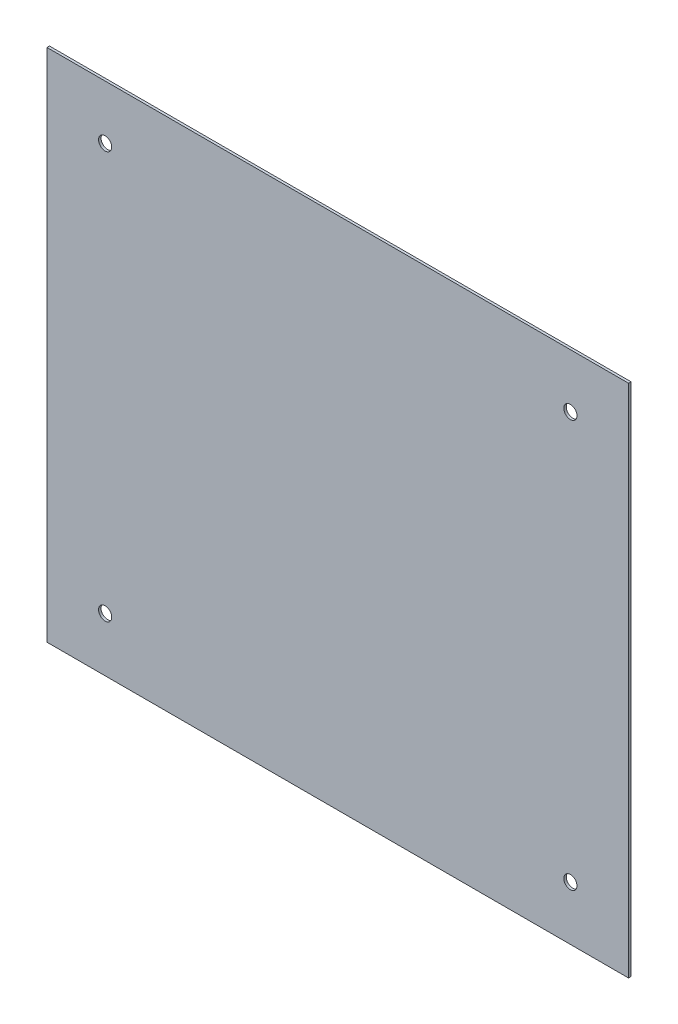
ISO-10303-21;
HEADER;
FILE_DESCRIPTION(('STEP AP214'),'2;1');
FILE_NAME('part.step','',(''),(''),'','','');
FILE_SCHEMA(('AUTOMOTIVE_DESIGN { 1 0 10303 214 1 1 1 1 }'));
ENDSEC;
DATA;
#1=APPLICATION_CONTEXT('core data for automotive mechanical design processes');
#2=APPLICATION_PROTOCOL_DEFINITION('international standard','automotive_design',2000,#1);
#3=PRODUCT_CONTEXT('',#1,'mechanical');
#4=PRODUCT('Part','Part','',(#3));
#5=PRODUCT_RELATED_PRODUCT_CATEGORY('part','',(#4));
#6=PRODUCT_DEFINITION_FORMATION('','',#4);
#7=PRODUCT_DEFINITION_CONTEXT('part definition',#1,'design');
#8=PRODUCT_DEFINITION('design','',#6,#7);
#9=PRODUCT_DEFINITION_SHAPE('','',#8);
#10=(LENGTH_UNIT() NAMED_UNIT(*) SI_UNIT(.MILLI.,.METRE.));
#11=(NAMED_UNIT(*) PLANE_ANGLE_UNIT() SI_UNIT($,.RADIAN.));
#12=(NAMED_UNIT(*) SI_UNIT($,.STERADIAN.) SOLID_ANGLE_UNIT());
#13=UNCERTAINTY_MEASURE_WITH_UNIT(LENGTH_MEASURE(1.E-05),#10,'distance_accuracy_value','');
#14=(GEOMETRIC_REPRESENTATION_CONTEXT(3) GLOBAL_UNCERTAINTY_ASSIGNED_CONTEXT((#13)) GLOBAL_UNIT_ASSIGNED_CONTEXT((#10,
#11,#12)) REPRESENTATION_CONTEXT('',''));
#15=CARTESIAN_POINT('',(0.,0.,0.));
#16=DIRECTION('',(0.,0.,1.));
#17=DIRECTION('',(1.,0.,0.));
#18=AXIS2_PLACEMENT_3D('',#15,#16,#17);
#19=CARTESIAN_POINT('',(-175.,-155.,1.5));
#20=DIRECTION('',(1.,0.,0.));
#21=DIRECTION('',(0.,0.,-1.));
#22=AXIS2_PLACEMENT_3D('',#19,#20,#21);
#23=PLANE('',#22);
#24=DIRECTION('',(0.,-1.,0.));
#25=VECTOR('',#24,1.);
#26=CARTESIAN_POINT('',(-175.,-155.,0.));
#27=LINE('',#26,#25);
#28=CARTESIAN_POINT('',(-175.,155.,0.));
#29=VERTEX_POINT('',#28);
#30=CARTESIAN_POINT('',(-175.,-155.,0.));
#31=VERTEX_POINT('',#30);
#32=EDGE_CURVE('E103',#29,#31,#27,.T.);
#33=ORIENTED_EDGE('',*,*,#32,.T.);
#34=DIRECTION('',(0.,0.,-1.));
#35=VECTOR('',#34,1.);
#36=CARTESIAN_POINT('',(-175.,-155.,1.5));
#37=LINE('',#36,#35);
#38=CARTESIAN_POINT('',(-175.,-155.,1.5));
#39=VERTEX_POINT('',#38);
#40=EDGE_CURVE('E11',#39,#31,#37,.T.);
#41=ORIENTED_EDGE('',*,*,#40,.F.);
#42=DIRECTION('',(0.,-1.,0.));
#43=VECTOR('',#42,1.);
#44=CARTESIAN_POINT('',(-175.,-155.,1.5));
#45=LINE('',#44,#43);
#46=CARTESIAN_POINT('',(-175.,155.,1.5));
#47=VERTEX_POINT('',#46);
#48=EDGE_CURVE('E90',#47,#39,#45,.T.);
#49=ORIENTED_EDGE('',*,*,#48,.F.);
#50=DIRECTION('',(0.,0.,-1.));
#51=VECTOR('',#50,1.);
#52=CARTESIAN_POINT('',(-175.,155.,1.5));
#53=LINE('',#52,#51);
#54=EDGE_CURVE('E99',#47,#29,#53,.T.);
#55=ORIENTED_EDGE('',*,*,#54,.T.);
#56=EDGE_LOOP('',(#33,#41,#49,#55));
#57=FACE_BOUND('',#56,.T.);
#58=ADVANCED_FACE('F37',(#57),#23,.F.);
#59=CARTESIAN_POINT('',(175.,-155.,1.5));
#60=DIRECTION('',(0.,1.,0.));
#61=DIRECTION('',(-1.,0.,0.));
#62=AXIS2_PLACEMENT_3D('',#59,#60,#61);
#63=PLANE('',#62);
#64=DIRECTION('',(1.,0.,0.));
#65=VECTOR('',#64,1.);
#66=CARTESIAN_POINT('',(175.,-155.,0.));
#67=LINE('',#66,#65);
#68=CARTESIAN_POINT('',(175.,-155.,0.));
#69=VERTEX_POINT('',#68);
#70=EDGE_CURVE('E94',#31,#69,#67,.T.);
#71=ORIENTED_EDGE('',*,*,#70,.T.);
#72=DIRECTION('',(0.,0.,-1.));
#73=VECTOR('',#72,1.);
#74=CARTESIAN_POINT('',(175.,-155.,1.5));
#75=LINE('',#74,#73);
#76=CARTESIAN_POINT('',(175.,-155.,1.5));
#77=VERTEX_POINT('',#76);
#78=EDGE_CURVE('E46',#77,#69,#75,.T.);
#79=ORIENTED_EDGE('',*,*,#78,.F.);
#80=DIRECTION('',(1.,0.,0.));
#81=VECTOR('',#80,1.);
#82=CARTESIAN_POINT('',(175.,-155.,1.5));
#83=LINE('',#82,#81);
#84=EDGE_CURVE('E85',#39,#77,#83,.T.);
#85=ORIENTED_EDGE('',*,*,#84,.F.);
#86=ORIENTED_EDGE('',*,*,#40,.T.);
#87=EDGE_LOOP('',(#71,#79,#85,#86));
#88=FACE_BOUND('',#87,.T.);
#89=ADVANCED_FACE('F93',(#88),#63,.F.);
#90=CARTESIAN_POINT('',(175.,-155.,1.5));
#91=DIRECTION('',(-1.,0.,0.));
#92=DIRECTION('',(0.,0.,1.));
#93=AXIS2_PLACEMENT_3D('',#90,#91,#92);
#94=PLANE('',#93);
#95=DIRECTION('',(0.,1.,0.));
#96=VECTOR('',#95,1.);
#97=CARTESIAN_POINT('',(175.,-155.,0.));
#98=LINE('',#97,#96);
#99=CARTESIAN_POINT('',(175.,155.,0.));
#100=VERTEX_POINT('',#99);
#101=EDGE_CURVE('E72',#69,#100,#98,.T.);
#102=ORIENTED_EDGE('',*,*,#101,.T.);
#103=DIRECTION('',(0.,0.,-1.));
#104=VECTOR('',#103,1.);
#105=CARTESIAN_POINT('',(175.,155.,1.5));
#106=LINE('',#105,#104);
#107=CARTESIAN_POINT('',(175.,155.,1.5));
#108=VERTEX_POINT('',#107);
#109=EDGE_CURVE('E95',#108,#100,#106,.T.);
#110=ORIENTED_EDGE('',*,*,#109,.F.);
#111=DIRECTION('',(0.,1.,0.));
#112=VECTOR('',#111,1.);
#113=CARTESIAN_POINT('',(175.,-155.,1.5));
#114=LINE('',#113,#112);
#115=EDGE_CURVE('E88',#77,#108,#114,.T.);
#116=ORIENTED_EDGE('',*,*,#115,.F.);
#117=ORIENTED_EDGE('',*,*,#78,.T.);
#118=EDGE_LOOP('',(#102,#110,#116,#117));
#119=FACE_BOUND('',#118,.T.);
#120=ADVANCED_FACE('F97',(#119),#94,.F.);
#121=CARTESIAN_POINT('',(175.,155.,1.5));
#122=DIRECTION('',(0.,-1.,0.));
#123=DIRECTION('',(1.,0.,0.));
#124=AXIS2_PLACEMENT_3D('',#121,#122,#123);
#125=PLANE('',#124);
#126=DIRECTION('',(-1.,0.,0.));
#127=VECTOR('',#126,1.);
#128=CARTESIAN_POINT('',(175.,155.,0.));
#129=LINE('',#128,#127);
#130=EDGE_CURVE('E78',#100,#29,#129,.T.);
#131=ORIENTED_EDGE('',*,*,#130,.T.);
#132=ORIENTED_EDGE('',*,*,#54,.F.);
#133=DIRECTION('',(-1.,0.,0.));
#134=VECTOR('',#133,1.);
#135=CARTESIAN_POINT('',(175.,155.,1.5));
#136=LINE('',#135,#134);
#137=EDGE_CURVE('E55',#108,#47,#136,.T.);
#138=ORIENTED_EDGE('',*,*,#137,.F.);
#139=ORIENTED_EDGE('',*,*,#109,.T.);
#140=EDGE_LOOP('',(#131,#132,#138,#139));
#141=FACE_BOUND('',#140,.T.);
#142=ADVANCED_FACE('F151',(#141),#125,.F.);
#143=CARTESIAN_POINT('',(0.,0.,1.5));
#144=DIRECTION('',(0.,0.,1.));
#145=DIRECTION('',(1.,0.,0.));
#146=AXIS2_PLACEMENT_3D('',#143,#144,#145);
#147=PLANE('',#146);
#148=CARTESIAN_POINT('',(140.,122.5,1.5));
#149=DIRECTION('',(0.,0.,1.));
#150=DIRECTION('',(1.,0.,0.));
#151=AXIS2_PLACEMENT_3D('',#148,#149,#150);
#152=CIRCLE('',#151,3.96999999999999);
#153=CARTESIAN_POINT('',(143.97,122.5,1.5));
#154=VERTEX_POINT('',#153);
#155=EDGE_CURVE('E115',#154,#154,#152,.F.);
#156=ORIENTED_EDGE('',*,*,#155,.T.);
#157=EDGE_LOOP('',(#156));
#158=FACE_BOUND('',#157,.T.);
#159=CARTESIAN_POINT('',(-140.,-122.5,1.5));
#160=DIRECTION('',(0.,0.,1.));
#161=DIRECTION('',(1.,0.,0.));
#162=AXIS2_PLACEMENT_3D('',#159,#160,#161);
#163=CIRCLE('',#162,3.96999999999999);
#164=CARTESIAN_POINT('',(-136.03,-122.5,1.5));
#165=VERTEX_POINT('',#164);
#166=EDGE_CURVE('E121',#165,#165,#163,.F.);
#167=ORIENTED_EDGE('',*,*,#166,.T.);
#168=EDGE_LOOP('',(#167));
#169=FACE_BOUND('',#168,.T.);
#170=CARTESIAN_POINT('',(140.,-122.5,1.5));
#171=DIRECTION('',(0.,0.,1.));
#172=DIRECTION('',(1.,0.,0.));
#173=AXIS2_PLACEMENT_3D('',#170,#171,#172);
#174=CIRCLE('',#173,3.96999999999999);
#175=CARTESIAN_POINT('',(143.97,-122.5,1.5));
#176=VERTEX_POINT('',#175);
#177=EDGE_CURVE('E118',#176,#176,#174,.F.);
#178=ORIENTED_EDGE('',*,*,#177,.T.);
#179=EDGE_LOOP('',(#178));
#180=FACE_BOUND('',#179,.T.);
#181=CARTESIAN_POINT('',(-140.,122.5,1.5));
#182=DIRECTION('',(0.,0.,1.));
#183=DIRECTION('',(1.,0.,0.));
#184=AXIS2_PLACEMENT_3D('',#181,#182,#183);
#185=CIRCLE('',#184,3.96999999999999);
#186=CARTESIAN_POINT('',(-136.03,122.5,1.5));
#187=VERTEX_POINT('',#186);
#188=EDGE_CURVE('E106',#187,#187,#185,.F.);
#189=ORIENTED_EDGE('',*,*,#188,.T.);
#190=EDGE_LOOP('',(#189));
#191=FACE_BOUND('',#190,.T.);
#192=ORIENTED_EDGE('',*,*,#48,.T.);
#193=ORIENTED_EDGE('',*,*,#84,.T.);
#194=ORIENTED_EDGE('',*,*,#115,.T.);
#195=ORIENTED_EDGE('',*,*,#137,.T.);
#196=EDGE_LOOP('',(#192,#193,#194,#195));
#197=FACE_BOUND('',#196,.T.);
#198=ADVANCED_FACE('F86',(#158,#169,#180,#191,#197),#147,.T.);
#199=CARTESIAN_POINT('',(0.,0.,0.));
#200=DIRECTION('',(0.,0.,1.));
#201=DIRECTION('',(1.,0.,0.));
#202=AXIS2_PLACEMENT_3D('',#199,#200,#201);
#203=PLANE('',#202);
#204=CARTESIAN_POINT('',(140.,122.5,0.));
#205=DIRECTION('',(0.,0.,1.));
#206=DIRECTION('',(1.,0.,0.));
#207=AXIS2_PLACEMENT_3D('',#204,#205,#206);
#208=CIRCLE('',#207,3.96999999999999);
#209=CARTESIAN_POINT('',(143.97,122.5,0.));
#210=VERTEX_POINT('',#209);
#211=EDGE_CURVE('E40',#210,#210,#208,.F.);
#212=ORIENTED_EDGE('',*,*,#211,.F.);
#213=EDGE_LOOP('',(#212));
#214=FACE_BOUND('',#213,.T.);
#215=CARTESIAN_POINT('',(-140.,-122.5,0.));
#216=DIRECTION('',(0.,0.,1.));
#217=DIRECTION('',(1.,0.,0.));
#218=AXIS2_PLACEMENT_3D('',#215,#216,#217);
#219=CIRCLE('',#218,3.96999999999999);
#220=CARTESIAN_POINT('',(-136.03,-122.5,0.));
#221=VERTEX_POINT('',#220);
#222=EDGE_CURVE('E119',#221,#221,#219,.F.);
#223=ORIENTED_EDGE('',*,*,#222,.F.);
#224=EDGE_LOOP('',(#223));
#225=FACE_BOUND('',#224,.T.);
#226=CARTESIAN_POINT('',(140.,-122.5,0.));
#227=DIRECTION('',(0.,0.,1.));
#228=DIRECTION('',(1.,0.,0.));
#229=AXIS2_PLACEMENT_3D('',#226,#227,#228);
#230=CIRCLE('',#229,3.96999999999999);
#231=CARTESIAN_POINT('',(143.97,-122.5,0.));
#232=VERTEX_POINT('',#231);
#233=EDGE_CURVE('E116',#232,#232,#230,.F.);
#234=ORIENTED_EDGE('',*,*,#233,.F.);
#235=EDGE_LOOP('',(#234));
#236=FACE_BOUND('',#235,.T.);
#237=CARTESIAN_POINT('',(-140.,122.5,0.));
#238=DIRECTION('',(0.,0.,1.));
#239=DIRECTION('',(1.,0.,0.));
#240=AXIS2_PLACEMENT_3D('',#237,#238,#239);
#241=CIRCLE('',#240,3.96999999999999);
#242=CARTESIAN_POINT('',(-136.03,122.5,0.));
#243=VERTEX_POINT('',#242);
#244=EDGE_CURVE('E112',#243,#243,#241,.F.);
#245=ORIENTED_EDGE('',*,*,#244,.F.);
#246=EDGE_LOOP('',(#245));
#247=FACE_BOUND('',#246,.T.);
#248=ORIENTED_EDGE('',*,*,#32,.F.);
#249=ORIENTED_EDGE('',*,*,#130,.F.);
#250=ORIENTED_EDGE('',*,*,#101,.F.);
#251=ORIENTED_EDGE('',*,*,#70,.F.);
#252=EDGE_LOOP('',(#248,#249,#250,#251));
#253=FACE_BOUND('',#252,.T.);
#254=ADVANCED_FACE('F141',(#214,#225,#236,#247,#253),#203,.F.);
#255=CARTESIAN_POINT('',(-140.,122.5,11.5));
#256=DIRECTION('',(0.,0.,-1.));
#257=DIRECTION('',(-1.,0.,0.));
#258=AXIS2_PLACEMENT_3D('',#255,#256,#257);
#259=CYLINDRICAL_SURFACE('',#258,3.96999999999999);
#260=ORIENTED_EDGE('',*,*,#188,.F.);
#261=EDGE_LOOP('',(#260));
#262=FACE_BOUND('',#261,.T.);
#263=ORIENTED_EDGE('',*,*,#244,.T.);
#264=EDGE_LOOP('',(#263));
#265=FACE_BOUND('',#264,.T.);
#266=ADVANCED_FACE('F137',(#262,#265),#259,.F.);
#267=CARTESIAN_POINT('',(140.,-122.5,11.5));
#268=DIRECTION('',(0.,0.,-1.));
#269=DIRECTION('',(-1.,0.,0.));
#270=AXIS2_PLACEMENT_3D('',#267,#268,#269);
#271=CYLINDRICAL_SURFACE('',#270,3.96999999999999);
#272=ORIENTED_EDGE('',*,*,#177,.F.);
#273=EDGE_LOOP('',(#272));
#274=FACE_BOUND('',#273,.T.);
#275=ORIENTED_EDGE('',*,*,#233,.T.);
#276=EDGE_LOOP('',(#275));
#277=FACE_BOUND('',#276,.T.);
#278=ADVANCED_FACE('F140',(#274,#277),#271,.F.);
#279=CARTESIAN_POINT('',(-140.,-122.5,11.5));
#280=DIRECTION('',(0.,0.,-1.));
#281=DIRECTION('',(-1.,0.,0.));
#282=AXIS2_PLACEMENT_3D('',#279,#280,#281);
#283=CYLINDRICAL_SURFACE('',#282,3.96999999999999);
#284=ORIENTED_EDGE('',*,*,#166,.F.);
#285=EDGE_LOOP('',(#284));
#286=FACE_BOUND('',#285,.T.);
#287=ORIENTED_EDGE('',*,*,#222,.T.);
#288=EDGE_LOOP('',(#287));
#289=FACE_BOUND('',#288,.T.);
#290=ADVANCED_FACE('F198',(#286,#289),#283,.F.);
#291=CARTESIAN_POINT('',(140.,122.5,11.5));
#292=DIRECTION('',(0.,0.,-1.));
#293=DIRECTION('',(-1.,0.,0.));
#294=AXIS2_PLACEMENT_3D('',#291,#292,#293);
#295=CYLINDRICAL_SURFACE('',#294,3.96999999999999);
#296=ORIENTED_EDGE('',*,*,#155,.F.);
#297=EDGE_LOOP('',(#296));
#298=FACE_BOUND('',#297,.T.);
#299=ORIENTED_EDGE('',*,*,#211,.T.);
#300=EDGE_LOOP('',(#299));
#301=FACE_BOUND('',#300,.T.);
#302=ADVANCED_FACE('F208',(#298,#301),#295,.F.);
#303=CLOSED_SHELL('',(#58,#89,#120,#142,#198,#254,#266,#278,#290,#302));
#304=MANIFOLD_SOLID_BREP('B2',#303);
#305=ADVANCED_BREP_SHAPE_REPRESENTATION('',(#18,#304),#14);
#306=SHAPE_DEFINITION_REPRESENTATION(#9,#305);
ENDSEC;
END-ISO-10303-21;
